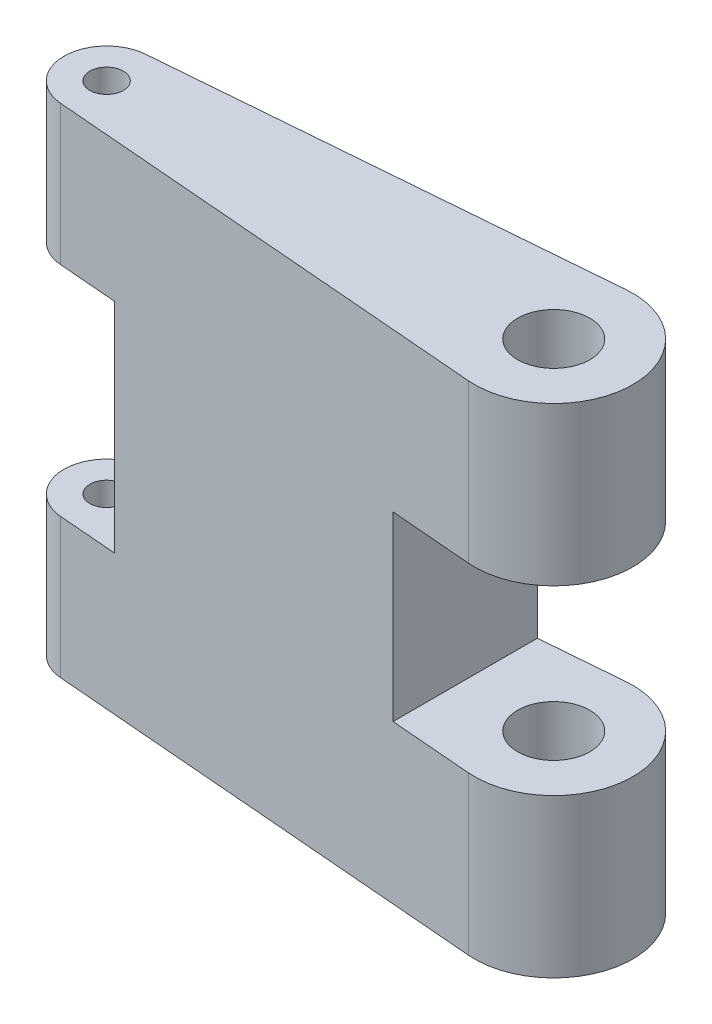
ISO-10303-21;
HEADER;
FILE_DESCRIPTION(('STEP AP214'),'2;1');
FILE_NAME('part.step','',(''),(''),'','','');
FILE_SCHEMA(('AUTOMOTIVE_DESIGN { 1 0 10303 214 1 1 1 1 }'));
ENDSEC;
DATA;
#1=APPLICATION_CONTEXT('core data for automotive mechanical design processes');
#2=APPLICATION_PROTOCOL_DEFINITION('international standard','automotive_design',2000,#1);
#3=PRODUCT_CONTEXT('',#1,'mechanical');
#4=PRODUCT('Part','Part','',(#3));
#5=PRODUCT_RELATED_PRODUCT_CATEGORY('part','',(#4));
#6=PRODUCT_DEFINITION_FORMATION('','',#4);
#7=PRODUCT_DEFINITION_CONTEXT('part definition',#1,'design');
#8=PRODUCT_DEFINITION('design','',#6,#7);
#9=PRODUCT_DEFINITION_SHAPE('','',#8);
#10=(LENGTH_UNIT() NAMED_UNIT(*) SI_UNIT(.MILLI.,.METRE.));
#11=(NAMED_UNIT(*) PLANE_ANGLE_UNIT() SI_UNIT($,.RADIAN.));
#12=(NAMED_UNIT(*) SI_UNIT($,.STERADIAN.) SOLID_ANGLE_UNIT());
#13=UNCERTAINTY_MEASURE_WITH_UNIT(LENGTH_MEASURE(1.E-05),#10,'distance_accuracy_value','');
#14=(GEOMETRIC_REPRESENTATION_CONTEXT(3) GLOBAL_UNCERTAINTY_ASSIGNED_CONTEXT((#13)) GLOBAL_UNIT_ASSIGNED_CONTEXT((#10,
#11,#12)) REPRESENTATION_CONTEXT('',''));
#15=CARTESIAN_POINT('',(0.,0.,0.));
#16=DIRECTION('',(0.,0.,1.));
#17=DIRECTION('',(1.,0.,0.));
#18=AXIS2_PLACEMENT_3D('',#15,#16,#17);
#19=CARTESIAN_POINT('',(-20.32,-11.304095629,0.));
#20=DIRECTION('',(0.,1.,0.));
#21=DIRECTION('',(0.,0.,1.));
#22=AXIS2_PLACEMENT_3D('',#19,#20,#21);
#23=CYLINDRICAL_SURFACE('',#22,1.9378704951052);
#24=DIRECTION('',(0.,1.,0.));
#25=VECTOR('',#24,1.);
#26=CARTESIAN_POINT('',(-20.4781967950132,-11.304095629,-1.93140255510001));
#27=LINE('',#26,#25);
#28=CARTESIAN_POINT('',(-20.4781967950132,4.954095629,-1.93140255510001));
#29=VERTEX_POINT('',#28);
#30=CARTESIAN_POINT('',(-20.4781967950132,11.304095629,-1.93140255510001));
#31=VERTEX_POINT('',#30);
#32=EDGE_CURVE('E208',#29,#31,#27,.T.);
#33=ORIENTED_EDGE('',*,*,#32,.F.);
#34=CARTESIAN_POINT('',(-20.32,4.954095629,0.));
#35=DIRECTION('',(0.,1.,0.));
#36=DIRECTION('',(0.,0.,1.));
#37=AXIS2_PLACEMENT_3D('',#34,#35,#36);
#38=CIRCLE('',#37,1.9378704951052);
#39=CARTESIAN_POINT('',(-20.4781967950132,4.954095629,1.93140255510001));
#40=VERTEX_POINT('',#39);
#41=EDGE_CURVE('E141',#40,#29,#38,.F.);
#42=ORIENTED_EDGE('',*,*,#41,.F.);
#43=DIRECTION('',(0.,1.,0.));
#44=VECTOR('',#43,1.);
#45=CARTESIAN_POINT('',(-20.4781967950132,-11.304095629,1.93140255510001));
#46=LINE('',#45,#44);
#47=CARTESIAN_POINT('',(-20.4781967950132,11.304095629,1.93140255510001));
#48=VERTEX_POINT('',#47);
#49=EDGE_CURVE('E204',#40,#48,#46,.T.);
#50=ORIENTED_EDGE('',*,*,#49,.T.);
#51=CARTESIAN_POINT('',(-20.32,11.304095629,0.));
#52=DIRECTION('',(0.,1.,0.));
#53=DIRECTION('',(0.,0.,1.));
#54=AXIS2_PLACEMENT_3D('',#51,#52,#53);
#55=CIRCLE('',#54,1.9378704951052);
#56=EDGE_CURVE('E192',#31,#48,#55,.T.);
#57=ORIENTED_EDGE('',*,*,#56,.F.);
#58=EDGE_LOOP('',(#33,#42,#50,#57));
#59=FACE_BOUND('',#58,.T.);
#60=ADVANCED_FACE('F32',(#59),#23,.T.);
#61=CARTESIAN_POINT('',(0.,-11.304095629,0.));
#62=DIRECTION('',(0.,1.,0.));
#63=DIRECTION('',(0.,0.,1.));
#64=AXIS2_PLACEMENT_3D('',#61,#62,#63);
#65=CYLINDRICAL_SURFACE('',#64,3.59668045314266);
#66=DIRECTION('',(0.,1.,0.));
#67=VECTOR('',#66,1.);
#68=CARTESIAN_POINT('',(-0.293612664938569,-11.304095629,-3.58467598047664));
#69=LINE('',#68,#67);
#70=CARTESIAN_POINT('',(-0.293612664938569,-11.304095629,-3.58467598047664));
#71=VERTEX_POINT('',#70);
#72=CARTESIAN_POINT('',(-0.293612664938569,-4.1261685727369,-3.58467598047664));
#73=VERTEX_POINT('',#72);
#74=EDGE_CURVE('E209',#71,#73,#69,.T.);
#75=ORIENTED_EDGE('',*,*,#74,.T.);
#76=CARTESIAN_POINT('',(0.,-4.1261685727369,0.));
#77=DIRECTION('',(0.,-1.,0.));
#78=DIRECTION('',(0.,0.,-1.));
#79=AXIS2_PLACEMENT_3D('',#76,#77,#78);
#80=CIRCLE('',#79,3.59668045314266);
#81=CARTESIAN_POINT('',(-0.293612664938569,-4.1261685727369,3.58467598047664));
#82=VERTEX_POINT('',#81);
#83=EDGE_CURVE('E56',#82,#73,#80,.F.);
#84=ORIENTED_EDGE('',*,*,#83,.F.);
#85=DIRECTION('',(0.,1.,0.));
#86=VECTOR('',#85,1.);
#87=CARTESIAN_POINT('',(-0.293612664938569,-11.304095629,3.58467598047664));
#88=LINE('',#87,#86);
#89=CARTESIAN_POINT('',(-0.293612664938569,-11.304095629,3.58467598047664));
#90=VERTEX_POINT('',#89);
#91=EDGE_CURVE('E197',#90,#82,#88,.T.);
#92=ORIENTED_EDGE('',*,*,#91,.F.);
#93=CARTESIAN_POINT('',(0.,-11.304095629,0.));
#94=DIRECTION('',(0.,1.,0.));
#95=DIRECTION('',(0.,0.,1.));
#96=AXIS2_PLACEMENT_3D('',#93,#94,#95);
#97=CIRCLE('',#96,3.59668045314266);
#98=EDGE_CURVE('E173',#90,#71,#97,.T.);
#99=ORIENTED_EDGE('',*,*,#98,.T.);
#100=EDGE_LOOP('',(#75,#84,#92,#99));
#101=FACE_BOUND('',#100,.T.);
#102=ADVANCED_FACE('F236',(#101),#65,.T.);
#103=CARTESIAN_POINT('',(0.,4.1261685727369,0.));
#104=DIRECTION('',(0.,1.,0.));
#105=DIRECTION('',(0.,0.,1.));
#106=AXIS2_PLACEMENT_3D('',#103,#104,#105);
#107=CIRCLE('',#106,3.59668045314266);
#108=CARTESIAN_POINT('',(-0.293612664938569,4.1261685727369,-3.58467598047664));
#109=VERTEX_POINT('',#108);
#110=CARTESIAN_POINT('',(-0.293612664938569,4.1261685727369,3.58467598047664));
#111=VERTEX_POINT('',#110);
#112=EDGE_CURVE('E166',#109,#111,#107,.F.);
#113=ORIENTED_EDGE('',*,*,#112,.F.);
#114=CARTESIAN_POINT('',(-0.293612664938569,11.304095629,-3.58467598047664));
#115=VERTEX_POINT('',#114);
#116=EDGE_CURVE('E186',#109,#115,#69,.T.);
#117=ORIENTED_EDGE('',*,*,#116,.T.);
#118=CARTESIAN_POINT('',(0.,11.304095629,0.));
#119=DIRECTION('',(0.,1.,0.));
#120=DIRECTION('',(0.,0.,1.));
#121=AXIS2_PLACEMENT_3D('',#118,#119,#120);
#122=CIRCLE('',#121,3.59668045314266);
#123=CARTESIAN_POINT('',(-0.293612664938569,11.304095629,3.58467598047664));
#124=VERTEX_POINT('',#123);
#125=EDGE_CURVE('E172',#124,#115,#122,.T.);
#126=ORIENTED_EDGE('',*,*,#125,.F.);
#127=EDGE_CURVE('E201',#111,#124,#88,.T.);
#128=ORIENTED_EDGE('',*,*,#127,.F.);
#129=EDGE_LOOP('',(#113,#117,#126,#128));
#130=FACE_BOUND('',#129,.T.);
#131=ADVANCED_FACE('F34',(#130),#65,.T.);
#132=CARTESIAN_POINT('',(-20.4781967950132,-11.304095629,1.93140255510001));
#133=DIRECTION('',(-0.081634348328615,0.,0.996662346621443));
#134=DIRECTION('',(0.996662346621444,0.,0.081634348328615));
#135=AXIS2_PLACEMENT_3D('',#132,#133,#134);
#136=PLANE('',#135);
#137=DIRECTION('',(-0.996662346621444,0.,-0.081634348328615));
#138=VECTOR('',#137,1.);
#139=CARTESIAN_POINT('',(-20.4781967950132,4.954095629,1.93140255510001));
#140=LINE('',#139,#138);
#141=CARTESIAN_POINT('',(-17.8128704951052,4.954095629,2.14971337652683));
#142=VERTEX_POINT('',#141);
#143=EDGE_CURVE('E140',#142,#40,#140,.T.);
#144=ORIENTED_EDGE('',*,*,#143,.F.);
#145=DIRECTION('',(0.,1.,0.));
#146=VECTOR('',#145,1.);
#147=CARTESIAN_POINT('',(-17.8128704951052,-11.304095629,2.14971337652683));
#148=LINE('',#147,#146);
#149=CARTESIAN_POINT('',(-17.8128704951052,-4.954095629,2.14971337652683));
#150=VERTEX_POINT('',#149);
#151=EDGE_CURVE('E126',#150,#142,#148,.T.);
#152=ORIENTED_EDGE('',*,*,#151,.F.);
#153=DIRECTION('',(0.996662346621444,0.,0.081634348328615));
#154=VECTOR('',#153,1.);
#155=CARTESIAN_POINT('',(-20.4781967950132,-4.954095629,1.93140255510001));
#156=LINE('',#155,#154);
#157=CARTESIAN_POINT('',(-20.4781967950132,-4.954095629,1.93140255510001));
#158=VERTEX_POINT('',#157);
#159=EDGE_CURVE('E120',#158,#150,#156,.T.);
#160=ORIENTED_EDGE('',*,*,#159,.F.);
#161=CARTESIAN_POINT('',(-20.4781967950132,-11.304095629,1.93140255510001));
#162=VERTEX_POINT('',#161);
#163=EDGE_CURVE('E202',#162,#158,#46,.T.);
#164=ORIENTED_EDGE('',*,*,#163,.F.);
#165=DIRECTION('',(0.996662346621443,0.,0.081634348328615));
#166=VECTOR('',#165,1.);
#167=CARTESIAN_POINT('',(-20.4781967950132,-11.304095629,1.93140255510001));
#168=LINE('',#167,#166);
#169=EDGE_CURVE('E183',#162,#90,#168,.T.);
#170=ORIENTED_EDGE('',*,*,#169,.T.);
#171=ORIENTED_EDGE('',*,*,#91,.T.);
#172=DIRECTION('',(0.996662346621444,0.,0.081634348328615));
#173=VECTOR('',#172,1.);
#174=CARTESIAN_POINT('',(-20.4781967950132,-4.1261685727369,1.93140255510001));
#175=LINE('',#174,#173);
#176=CARTESIAN_POINT('',(-4.02331954685733,-4.1261685727369,3.2791841639208));
#177=VERTEX_POINT('',#176);
#178=EDGE_CURVE('E164',#177,#82,#175,.T.);
#179=ORIENTED_EDGE('',*,*,#178,.F.);
#180=DIRECTION('',(0.,-1.,0.));
#181=VECTOR('',#180,1.);
#182=CARTESIAN_POINT('',(-4.02331954685733,-11.304095629,3.2791841639208));
#183=LINE('',#182,#181);
#184=CARTESIAN_POINT('',(-4.02331954685733,4.1261685727369,3.2791841639208));
#185=VERTEX_POINT('',#184);
#186=EDGE_CURVE('E170',#185,#177,#183,.T.);
#187=ORIENTED_EDGE('',*,*,#186,.F.);
#188=DIRECTION('',(-0.996662346621444,0.,-0.081634348328615));
#189=VECTOR('',#188,1.);
#190=CARTESIAN_POINT('',(-20.4781967950132,4.1261685727369,1.93140255510001));
#191=LINE('',#190,#189);
#192=EDGE_CURVE('E168',#111,#185,#191,.T.);
#193=ORIENTED_EDGE('',*,*,#192,.F.);
#194=ORIENTED_EDGE('',*,*,#127,.T.);
#195=DIRECTION('',(0.996662346621443,0.,0.081634348328615));
#196=VECTOR('',#195,1.);
#197=CARTESIAN_POINT('',(-20.4781967950132,11.304095629,1.93140255510001));
#198=LINE('',#197,#196);
#199=EDGE_CURVE('E177',#48,#124,#198,.T.);
#200=ORIENTED_EDGE('',*,*,#199,.F.);
#201=ORIENTED_EDGE('',*,*,#49,.F.);
#202=EDGE_LOOP('',(#144,#152,#160,#164,#170,#171,#179,#187,#193,#194,#200,#201));
#203=FACE_BOUND('',#202,.T.);
#204=ADVANCED_FACE('F138',(#203),#136,.T.);
#205=CARTESIAN_POINT('',(-20.32,-4.954095629,0.));
#206=DIRECTION('',(0.,-1.,0.));
#207=DIRECTION('',(0.,0.,-1.));
#208=AXIS2_PLACEMENT_3D('',#205,#206,#207);
#209=CIRCLE('',#208,1.9378704951052);
#210=CARTESIAN_POINT('',(-20.4781967950132,-4.954095629,-1.93140255510001));
#211=VERTEX_POINT('',#210);
#212=EDGE_CURVE('E122',#211,#158,#209,.F.);
#213=ORIENTED_EDGE('',*,*,#212,.F.);
#214=CARTESIAN_POINT('',(-20.4781967950132,-11.304095629,-1.93140255510001));
#215=VERTEX_POINT('',#214);
#216=EDGE_CURVE('E205',#215,#211,#27,.T.);
#217=ORIENTED_EDGE('',*,*,#216,.F.);
#218=CARTESIAN_POINT('',(-20.32,-11.304095629,0.));
#219=DIRECTION('',(0.,1.,0.));
#220=DIRECTION('',(0.,0.,1.));
#221=AXIS2_PLACEMENT_3D('',#218,#219,#220);
#222=CIRCLE('',#221,1.9378704951052);
#223=EDGE_CURVE('E180',#215,#162,#222,.T.);
#224=ORIENTED_EDGE('',*,*,#223,.T.);
#225=ORIENTED_EDGE('',*,*,#163,.T.);
#226=EDGE_LOOP('',(#213,#217,#224,#225));
#227=FACE_BOUND('',#226,.T.);
#228=ADVANCED_FACE('F228',(#227),#23,.T.);
#229=CARTESIAN_POINT('',(-0.293612664938569,-11.304095629,-3.58467598047664));
#230=DIRECTION('',(-0.0816343483286153,0.,-0.996662346621443));
#231=DIRECTION('',(-0.996662346621444,0.,0.0816343483286153));
#232=AXIS2_PLACEMENT_3D('',#229,#230,#231);
#233=PLANE('',#232);
#234=DIRECTION('',(0.996662346621444,0.,-0.0816343483286153));
#235=VECTOR('',#234,1.);
#236=CARTESIAN_POINT('',(-0.293612664938569,4.954095629,-3.58467598047664));
#237=LINE('',#236,#235);
#238=CARTESIAN_POINT('',(-17.8128704951052,4.954095629,-2.14971337652682));
#239=VERTEX_POINT('',#238);
#240=EDGE_CURVE('E11',#29,#239,#237,.T.);
#241=ORIENTED_EDGE('',*,*,#240,.F.);
#242=ORIENTED_EDGE('',*,*,#32,.T.);
#243=DIRECTION('',(-0.996662346621443,0.,0.0816343483286153));
#244=VECTOR('',#243,1.);
#245=CARTESIAN_POINT('',(-0.293612664938569,11.304095629,-3.58467598047664));
#246=LINE('',#245,#244);
#247=EDGE_CURVE('E189',#115,#31,#246,.T.);
#248=ORIENTED_EDGE('',*,*,#247,.F.);
#249=ORIENTED_EDGE('',*,*,#116,.F.);
#250=DIRECTION('',(0.996662346621444,0.,-0.0816343483286153));
#251=VECTOR('',#250,1.);
#252=CARTESIAN_POINT('',(-0.293612664938569,4.1261685727369,-3.58467598047664));
#253=LINE('',#252,#251);
#254=CARTESIAN_POINT('',(-4.02331954685734,4.1261685727369,-3.2791841639208));
#255=VERTEX_POINT('',#254);
#256=EDGE_CURVE('E215',#255,#109,#253,.T.);
#257=ORIENTED_EDGE('',*,*,#256,.F.);
#258=DIRECTION('',(0.,1.,0.));
#259=VECTOR('',#258,1.);
#260=CARTESIAN_POINT('',(-4.02331954685734,-11.304095629,-3.2791841639208));
#261=LINE('',#260,#259);
#262=CARTESIAN_POINT('',(-4.02331954685734,-4.1261685727369,-3.2791841639208));
#263=VERTEX_POINT('',#262);
#264=EDGE_CURVE('E213',#263,#255,#261,.T.);
#265=ORIENTED_EDGE('',*,*,#264,.F.);
#266=DIRECTION('',(-0.996662346621444,0.,0.0816343483286153));
#267=VECTOR('',#266,1.);
#268=CARTESIAN_POINT('',(-0.293612664938569,-4.1261685727369,-3.58467598047664));
#269=LINE('',#268,#267);
#270=EDGE_CURVE('E200',#73,#263,#269,.T.);
#271=ORIENTED_EDGE('',*,*,#270,.F.);
#272=ORIENTED_EDGE('',*,*,#74,.F.);
#273=DIRECTION('',(-0.996662346621443,0.,0.0816343483286153));
#274=VECTOR('',#273,1.);
#275=CARTESIAN_POINT('',(-0.293612664938569,-11.304095629,-3.58467598047664));
#276=LINE('',#275,#274);
#277=EDGE_CURVE('E176',#71,#215,#276,.T.);
#278=ORIENTED_EDGE('',*,*,#277,.T.);
#279=ORIENTED_EDGE('',*,*,#216,.T.);
#280=DIRECTION('',(-0.996662346621444,0.,0.0816343483286153));
#281=VECTOR('',#280,1.);
#282=CARTESIAN_POINT('',(-0.293612664938569,-4.954095629,-3.58467598047664));
#283=LINE('',#282,#281);
#284=CARTESIAN_POINT('',(-17.8128704951052,-4.954095629,-2.14971337652682));
#285=VERTEX_POINT('',#284);
#286=EDGE_CURVE('E218',#285,#211,#283,.T.);
#287=ORIENTED_EDGE('',*,*,#286,.F.);
#288=DIRECTION('',(0.,-1.,0.));
#289=VECTOR('',#288,1.);
#290=CARTESIAN_POINT('',(-17.8128704951052,-11.304095629,-2.14971337652682));
#291=LINE('',#290,#289);
#292=EDGE_CURVE('E41',#239,#285,#291,.T.);
#293=ORIENTED_EDGE('',*,*,#292,.F.);
#294=EDGE_LOOP('',(#241,#242,#248,#249,#257,#265,#271,#272,#278,#279,#287,#293));
#295=FACE_BOUND('',#294,.T.);
#296=ADVANCED_FACE('F224',(#295),#233,.T.);
#297=CARTESIAN_POINT('',(0.,-11.304095629,0.));
#298=DIRECTION('',(0.,1.,0.));
#299=DIRECTION('',(0.,0.,1.));
#300=AXIS2_PLACEMENT_3D('',#297,#298,#299);
#301=PLANE('',#300);
#302=CARTESIAN_POINT('',(-20.32,-11.304095629,0.));
#303=DIRECTION('',(0.,-1.,0.));
#304=DIRECTION('',(0.,0.,-1.));
#305=AXIS2_PLACEMENT_3D('',#302,#303,#304);
#306=CIRCLE('',#305,0.761999999999999);
#307=CARTESIAN_POINT('',(-20.32,-11.304095629,-0.761999999999997));
#308=VERTEX_POINT('',#307);
#309=EDGE_CURVE('E298',#308,#308,#306,.T.);
#310=ORIENTED_EDGE('',*,*,#309,.F.);
#311=EDGE_LOOP('',(#310));
#312=FACE_BOUND('',#311,.T.);
#313=CARTESIAN_POINT('',(0.,-11.304095629,0.));
#314=DIRECTION('',(0.,-1.,0.));
#315=DIRECTION('',(0.,0.,-1.));
#316=AXIS2_PLACEMENT_3D('',#313,#314,#315);
#317=CIRCLE('',#316,1.64);
#318=CARTESIAN_POINT('',(0.,-11.304095629,-1.64));
#319=VERTEX_POINT('',#318);
#320=EDGE_CURVE('E147',#319,#319,#317,.T.);
#321=ORIENTED_EDGE('',*,*,#320,.F.);
#322=EDGE_LOOP('',(#321));
#323=FACE_BOUND('',#322,.T.);
#324=ORIENTED_EDGE('',*,*,#98,.F.);
#325=ORIENTED_EDGE('',*,*,#169,.F.);
#326=ORIENTED_EDGE('',*,*,#223,.F.);
#327=ORIENTED_EDGE('',*,*,#277,.F.);
#328=EDGE_LOOP('',(#324,#325,#326,#327));
#329=FACE_BOUND('',#328,.T.);
#330=ADVANCED_FACE('F232',(#312,#323,#329),#301,.F.);
#331=CARTESIAN_POINT('',(0.,11.304095629,0.));
#332=DIRECTION('',(0.,1.,0.));
#333=DIRECTION('',(0.,0.,1.));
#334=AXIS2_PLACEMENT_3D('',#331,#332,#333);
#335=PLANE('',#334);
#336=CARTESIAN_POINT('',(-20.32,11.304095629,0.));
#337=DIRECTION('',(0.,-1.,0.));
#338=DIRECTION('',(0.,0.,-1.));
#339=AXIS2_PLACEMENT_3D('',#336,#337,#338);
#340=CIRCLE('',#339,0.761999999999999);
#341=CARTESIAN_POINT('',(-20.32,11.304095629,-0.761999999999997));
#342=VERTEX_POINT('',#341);
#343=EDGE_CURVE('E329',#342,#342,#340,.T.);
#344=ORIENTED_EDGE('',*,*,#343,.T.);
#345=EDGE_LOOP('',(#344));
#346=FACE_BOUND('',#345,.T.);
#347=CARTESIAN_POINT('',(0.,11.304095629,0.));
#348=DIRECTION('',(0.,-1.,0.));
#349=DIRECTION('',(0.,0.,-1.));
#350=AXIS2_PLACEMENT_3D('',#347,#348,#349);
#351=CIRCLE('',#350,1.64);
#352=CARTESIAN_POINT('',(0.,11.304095629,-1.64));
#353=VERTEX_POINT('',#352);
#354=EDGE_CURVE('E148',#353,#353,#351,.T.);
#355=ORIENTED_EDGE('',*,*,#354,.T.);
#356=EDGE_LOOP('',(#355));
#357=FACE_BOUND('',#356,.T.);
#358=ORIENTED_EDGE('',*,*,#125,.T.);
#359=ORIENTED_EDGE('',*,*,#247,.T.);
#360=ORIENTED_EDGE('',*,*,#56,.T.);
#361=ORIENTED_EDGE('',*,*,#199,.T.);
#362=EDGE_LOOP('',(#358,#359,#360,#361));
#363=FACE_BOUND('',#362,.T.);
#364=ADVANCED_FACE('F253',(#346,#357,#363),#335,.T.);
#365=CARTESIAN_POINT('',(-4.02331954685734,-4.1261685727369,-3.59668045314266));
#366=DIRECTION('',(-1.,0.,0.));
#367=DIRECTION('',(0.,0.,1.));
#368=AXIS2_PLACEMENT_3D('',#365,#366,#367);
#369=PLANE('',#368);
#370=ORIENTED_EDGE('',*,*,#186,.T.);
#371=DIRECTION('',(0.,0.,1.));
#372=VECTOR('',#371,1.);
#373=CARTESIAN_POINT('',(-4.02331954685734,-4.1261685727369,-3.59668045314266));
#374=LINE('',#373,#372);
#375=EDGE_CURVE('E157',#263,#177,#374,.T.);
#376=ORIENTED_EDGE('',*,*,#375,.F.);
#377=ORIENTED_EDGE('',*,*,#264,.T.);
#378=DIRECTION('',(0.,0.,1.));
#379=VECTOR('',#378,1.);
#380=CARTESIAN_POINT('',(-4.02331954685734,4.1261685727369,-3.59668045314266));
#381=LINE('',#380,#379);
#382=EDGE_CURVE('E158',#255,#185,#381,.T.);
#383=ORIENTED_EDGE('',*,*,#382,.T.);
#384=EDGE_LOOP('',(#370,#376,#377,#383));
#385=FACE_BOUND('',#384,.T.);
#386=ADVANCED_FACE('F242',(#385),#369,.F.);
#387=CARTESIAN_POINT('',(-4.02331954685734,4.1261685727369,-3.59668045314266));
#388=DIRECTION('',(0.,1.,0.));
#389=DIRECTION('',(0.,0.,1.));
#390=AXIS2_PLACEMENT_3D('',#387,#388,#389);
#391=PLANE('',#390);
#392=CARTESIAN_POINT('',(0.,4.1261685727369,0.));
#393=DIRECTION('',(0.,1.,0.));
#394=DIRECTION('',(0.,0.,1.));
#395=AXIS2_PLACEMENT_3D('',#392,#393,#394);
#396=CIRCLE('',#395,1.64);
#397=CARTESIAN_POINT('',(0.,4.1261685727369,-1.64));
#398=VERTEX_POINT('',#397);
#399=EDGE_CURVE('E154',#398,#398,#396,.T.);
#400=ORIENTED_EDGE('',*,*,#399,.T.);
#401=EDGE_LOOP('',(#400));
#402=FACE_BOUND('',#401,.T.);
#403=ORIENTED_EDGE('',*,*,#192,.T.);
#404=ORIENTED_EDGE('',*,*,#382,.F.);
#405=ORIENTED_EDGE('',*,*,#256,.T.);
#406=ORIENTED_EDGE('',*,*,#112,.T.);
#407=EDGE_LOOP('',(#403,#404,#405,#406));
#408=FACE_BOUND('',#407,.T.);
#409=ADVANCED_FACE('F260',(#402,#408),#391,.F.);
#410=CARTESIAN_POINT('',(-4.02331954685734,-4.1261685727369,-3.59668045314266));
#411=DIRECTION('',(0.,-1.,0.));
#412=DIRECTION('',(0.,0.,-1.));
#413=AXIS2_PLACEMENT_3D('',#410,#411,#412);
#414=PLANE('',#413);
#415=CARTESIAN_POINT('',(0.,-4.1261685727369,0.));
#416=DIRECTION('',(0.,-1.,0.));
#417=DIRECTION('',(0.,0.,-1.));
#418=AXIS2_PLACEMENT_3D('',#415,#416,#417);
#419=CIRCLE('',#418,1.64);
#420=CARTESIAN_POINT('',(0.,-4.12616857273689,-1.64));
#421=VERTEX_POINT('',#420);
#422=EDGE_CURVE('E151',#421,#421,#419,.T.);
#423=ORIENTED_EDGE('',*,*,#422,.T.);
#424=EDGE_LOOP('',(#423));
#425=FACE_BOUND('',#424,.T.);
#426=ORIENTED_EDGE('',*,*,#178,.T.);
#427=ORIENTED_EDGE('',*,*,#83,.T.);
#428=ORIENTED_EDGE('',*,*,#270,.T.);
#429=ORIENTED_EDGE('',*,*,#375,.T.);
#430=EDGE_LOOP('',(#426,#427,#428,#429));
#431=FACE_BOUND('',#430,.T.);
#432=ADVANCED_FACE('F240',(#425,#431),#414,.F.);
#433=CARTESIAN_POINT('',(0.,11.304095629,0.));
#434=DIRECTION('',(0.,-1.,0.));
#435=DIRECTION('',(0.,0.,-1.));
#436=AXIS2_PLACEMENT_3D('',#433,#434,#435);
#437=CYLINDRICAL_SURFACE('',#436,1.64);
#438=CARTESIAN_POINT('',(0.,-11.304095629,-1.64));
#439=CARTESIAN_POINT('',(0.,-11.2293255554973,-1.64));
#440=CARTESIAN_POINT('',(0.,-11.1545554819945,-1.64));
#441=CARTESIAN_POINT('',(0.,-11.005015334989,-1.64));
#442=CARTESIAN_POINT('',(0.,-10.9302452614863,-1.64));
#443=CARTESIAN_POINT('',(0.,-10.7807051144808,-1.64));
#444=CARTESIAN_POINT('',(0.,-10.7059350409781,-1.64));
#445=CARTESIAN_POINT('',(0.,-10.5563948939726,-1.64));
#446=CARTESIAN_POINT('',(0.,-10.4816248204699,-1.64));
#447=CARTESIAN_POINT('',(0.,-10.3320846734644,-1.64));
#448=CARTESIAN_POINT('',(0.,-10.2573145999616,-1.64));
#449=CARTESIAN_POINT('',(0.,-10.1077744529561,-1.64));
#450=CARTESIAN_POINT('',(0.,-10.0330043794534,-1.64));
#451=CARTESIAN_POINT('',(0.,-9.88346423244793,-1.64));
#452=CARTESIAN_POINT('',(0.,-9.80869415894519,-1.64));
#453=CARTESIAN_POINT('',(0.,-9.65915401193971,-1.64));
#454=CARTESIAN_POINT('',(0.,-9.58438393843697,-1.64));
#455=CARTESIAN_POINT('',(0.,-9.43484379143148,-1.64));
#456=CARTESIAN_POINT('',(0.,-9.36007371792874,-1.64));
#457=CARTESIAN_POINT('',(0.,-9.21053357092326,-1.64));
#458=CARTESIAN_POINT('',(0.,-9.13576349742052,-1.64));
#459=CARTESIAN_POINT('',(0.,-8.98622335041504,-1.64));
#460=CARTESIAN_POINT('',(0.,-8.9114532769123,-1.64));
#461=CARTESIAN_POINT('',(0.,-8.76191312990682,-1.64));
#462=CARTESIAN_POINT('',(0.,-8.68714305640408,-1.64));
#463=CARTESIAN_POINT('',(0.,-8.5376029093986,-1.64));
#464=CARTESIAN_POINT('',(0.,-8.46283283589585,-1.64));
#465=CARTESIAN_POINT('',(0.,-8.31329268889037,-1.64));
#466=CARTESIAN_POINT('',(0.,-8.23852261538763,-1.64));
#467=CARTESIAN_POINT('',(0.,-8.08898246838215,-1.64));
#468=CARTESIAN_POINT('',(0.,-8.01421239487941,-1.64));
#469=CARTESIAN_POINT('',(0.,-7.86467224787393,-1.64));
#470=CARTESIAN_POINT('',(0.,-7.78990217437119,-1.64));
#471=CARTESIAN_POINT('',(0.,-7.64036202736571,-1.64));
#472=CARTESIAN_POINT('',(0.,-7.56559195386297,-1.64));
#473=CARTESIAN_POINT('',(0.,-7.41605180685748,-1.64));
#474=CARTESIAN_POINT('',(0.,-7.34128173335474,-1.64));
#475=CARTESIAN_POINT('',(0.,-7.19174158634926,-1.64));
#476=CARTESIAN_POINT('',(0.,-7.11697151284652,-1.64));
#477=CARTESIAN_POINT('',(0.,-6.96743136584104,-1.64));
#478=CARTESIAN_POINT('',(0.,-6.8926612923383,-1.64));
#479=CARTESIAN_POINT('',(0.,-6.74312114533282,-1.64));
#480=CARTESIAN_POINT('',(0.,-6.66835107183008,-1.64));
#481=CARTESIAN_POINT('',(0.,-6.51881092482459,-1.64));
#482=CARTESIAN_POINT('',(0.,-6.44404085132186,-1.64));
#483=CARTESIAN_POINT('',(0.,-6.29450070431637,-1.64));
#484=CARTESIAN_POINT('',(0.,-6.21973063081363,-1.64));
#485=CARTESIAN_POINT('',(0.,-6.07019048380815,-1.64));
#486=CARTESIAN_POINT('',(0.,-5.99542041030541,-1.64));
#487=CARTESIAN_POINT('',(0.,-5.84588026329993,-1.64));
#488=CARTESIAN_POINT('',(0.,-5.77111018979719,-1.64));
#489=CARTESIAN_POINT('',(0.,-5.62157004279171,-1.64));
#490=CARTESIAN_POINT('',(0.,-5.54679996928897,-1.64));
#491=CARTESIAN_POINT('',(0.,-5.39725982228348,-1.64));
#492=CARTESIAN_POINT('',(0.,-5.32248974878074,-1.64));
#493=CARTESIAN_POINT('',(0.,-5.17294960177526,-1.64));
#494=CARTESIAN_POINT('',(0.,-5.09817952827252,-1.64));
#495=CARTESIAN_POINT('',(0.,-4.94863938126704,-1.64));
#496=CARTESIAN_POINT('',(0.,-4.8738693077643,-1.64));
#497=CARTESIAN_POINT('',(0.,-4.72432916075882,-1.64));
#498=CARTESIAN_POINT('',(0.,-4.64955908725608,-1.64));
#499=CARTESIAN_POINT('',(0.,-4.5000189402506,-1.64));
#500=CARTESIAN_POINT('',(0.,-4.42524886674785,-1.64));
#501=CARTESIAN_POINT('',(0.,-4.27570871974237,-1.64));
#502=CARTESIAN_POINT('',(0.,-4.20093864623963,-1.64));
#503=CARTESIAN_POINT('',(0.,-4.12616857273689,-1.64));
#504=B_SPLINE_CURVE_WITH_KNOTS('',3,(#438,#439,#440,#441,#442,#443,#444,#445,#446,#447,#448,
#449,#450,#451,#452,#453,#454,#455,#456,#457,#458,#459,#460,#461,#462,#463,#464,#465,#466,#467,
#468,#469,#470,#471,#472,#473,#474,#475,#476,#477,#478,#479,#480,#481,#482,#483,#484,#485,#486,
#487,#488,#489,#490,#491,#492,#493,#494,#495,#496,#497,#498,#499,#500,#501,#502,#503),
.UNSPECIFIED.,.F.,.F.,(4,2,2,2,2,2,2,2,2,2,2,2,2,2,2,2,2,2,2,2,2,2,2,2,2,2,2,2,2,2,2,2,4),(0.,
0.224310220508221,0.448620441016446,0.672930661524667,0.897240882032888,1.12155110254111,
1.34586132304933,1.57017154355756,1.79448176406578,2.018791984574,2.24310220508222,
2.46741242559044,2.69172264609866,2.91603286660689,3.14034308711511,3.36465330762333,
3.58896352813155,3.81327374863978,4.037583969148,4.26189418965622,4.48620441016444,
4.71051463067267,4.93482485118089,5.15913507168911,5.38344529219733,5.60775551270555,
5.83206573321378,6.056375953722,6.28068617423022,6.50499639473844,6.72930661524666,
6.95361683575489,7.17792705626311),.UNSPECIFIED.);
#505=EDGE_CURVE('BSEAM268',#319,#421,#504,.T.);
#506=ORIENTED_EDGE('',*,*,#320,.T.);
#507=ORIENTED_EDGE('',*,*,#422,.F.);
#508=ORIENTED_EDGE('',*,*,#505,.T.);
#509=ORIENTED_EDGE('',*,*,#505,.F.);
#510=EDGE_LOOP('',(#506,#508,#507,#509));
#511=FACE_BOUND('',#510,.T.);
#512=ADVANCED_FACE('F268',(#511),#437,.F.);
#513=CARTESIAN_POINT('',(0.,11.304095629,-1.64));
#514=CARTESIAN_POINT('',(0.,11.2293255554973,-1.64));
#515=CARTESIAN_POINT('',(0.,11.1545554819945,-1.64));
#516=CARTESIAN_POINT('',(0.,11.005015334989,-1.64));
#517=CARTESIAN_POINT('',(0.,10.9302452614863,-1.64));
#518=CARTESIAN_POINT('',(0.,10.7807051144808,-1.64));
#519=CARTESIAN_POINT('',(0.,10.7059350409781,-1.64));
#520=CARTESIAN_POINT('',(0.,10.5563948939726,-1.64));
#521=CARTESIAN_POINT('',(0.,10.4816248204699,-1.64));
#522=CARTESIAN_POINT('',(0.,10.3320846734644,-1.64));
#523=CARTESIAN_POINT('',(0.,10.2573145999616,-1.64));
#524=CARTESIAN_POINT('',(0.,10.1077744529561,-1.64));
#525=CARTESIAN_POINT('',(0.,10.0330043794534,-1.64));
#526=CARTESIAN_POINT('',(0.,9.88346423244793,-1.64));
#527=CARTESIAN_POINT('',(0.,9.80869415894519,-1.64));
#528=CARTESIAN_POINT('',(0.,9.65915401193971,-1.64));
#529=CARTESIAN_POINT('',(0.,9.58438393843696,-1.64));
#530=CARTESIAN_POINT('',(0.,9.43484379143148,-1.64));
#531=CARTESIAN_POINT('',(0.,9.36007371792874,-1.64));
#532=CARTESIAN_POINT('',(0.,9.21053357092326,-1.64));
#533=CARTESIAN_POINT('',(0.,9.13576349742052,-1.64));
#534=CARTESIAN_POINT('',(0.,8.98622335041504,-1.64));
#535=CARTESIAN_POINT('',(0.,8.9114532769123,-1.64));
#536=CARTESIAN_POINT('',(0.,8.76191312990682,-1.64));
#537=CARTESIAN_POINT('',(0.,8.68714305640408,-1.64));
#538=CARTESIAN_POINT('',(0.,8.5376029093986,-1.64));
#539=CARTESIAN_POINT('',(0.,8.46283283589585,-1.64));
#540=CARTESIAN_POINT('',(0.,8.31329268889037,-1.64));
#541=CARTESIAN_POINT('',(0.,8.23852261538763,-1.64));
#542=CARTESIAN_POINT('',(0.,8.08898246838215,-1.64));
#543=CARTESIAN_POINT('',(0.,8.01421239487941,-1.64));
#544=CARTESIAN_POINT('',(0.,7.86467224787393,-1.64));
#545=CARTESIAN_POINT('',(0.,7.78990217437119,-1.64));
#546=CARTESIAN_POINT('',(0.,7.64036202736571,-1.64));
#547=CARTESIAN_POINT('',(0.,7.56559195386297,-1.64));
#548=CARTESIAN_POINT('',(0.,7.41605180685749,-1.64));
#549=CARTESIAN_POINT('',(0.,7.34128173335474,-1.64));
#550=CARTESIAN_POINT('',(0.,7.19174158634926,-1.64));
#551=CARTESIAN_POINT('',(0.,7.11697151284652,-1.64));
#552=CARTESIAN_POINT('',(0.,6.96743136584104,-1.64));
#553=CARTESIAN_POINT('',(0.,6.8926612923383,-1.64));
#554=CARTESIAN_POINT('',(0.,6.74312114533282,-1.64));
#555=CARTESIAN_POINT('',(0.,6.66835107183008,-1.64));
#556=CARTESIAN_POINT('',(0.,6.5188109248246,-1.64));
#557=CARTESIAN_POINT('',(0.,6.44404085132186,-1.64));
#558=CARTESIAN_POINT('',(0.,6.29450070431638,-1.64));
#559=CARTESIAN_POINT('',(0.,6.21973063081363,-1.64));
#560=CARTESIAN_POINT('',(0.,6.07019048380815,-1.64));
#561=CARTESIAN_POINT('',(0.,5.99542041030541,-1.64));
#562=CARTESIAN_POINT('',(0.,5.84588026329993,-1.64));
#563=CARTESIAN_POINT('',(0.,5.77111018979719,-1.64));
#564=CARTESIAN_POINT('',(0.,5.62157004279171,-1.64));
#565=CARTESIAN_POINT('',(0.,5.54679996928897,-1.64));
#566=CARTESIAN_POINT('',(0.,5.39725982228349,-1.64));
#567=CARTESIAN_POINT('',(0.,5.32248974878075,-1.64));
#568=CARTESIAN_POINT('',(0.,5.17294960177527,-1.64));
#569=CARTESIAN_POINT('',(0.,5.09817952827253,-1.64));
#570=CARTESIAN_POINT('',(0.,4.94863938126704,-1.64));
#571=CARTESIAN_POINT('',(0.,4.8738693077643,-1.64));
#572=CARTESIAN_POINT('',(0.,4.72432916075882,-1.64));
#573=CARTESIAN_POINT('',(0.,4.64955908725608,-1.64));
#574=CARTESIAN_POINT('',(0.,4.5000189402506,-1.64));
#575=CARTESIAN_POINT('',(0.,4.42524886674786,-1.64));
#576=CARTESIAN_POINT('',(0.,4.27570871974238,-1.64));
#577=CARTESIAN_POINT('',(0.,4.20093864623964,-1.64));
#578=CARTESIAN_POINT('',(0.,4.1261685727369,-1.64));
#579=B_SPLINE_CURVE_WITH_KNOTS('',3,(#513,#514,#515,#516,#517,#518,#519,#520,#521,#522,#523,
#524,#525,#526,#527,#528,#529,#530,#531,#532,#533,#534,#535,#536,#537,#538,#539,#540,#541,#542,
#543,#544,#545,#546,#547,#548,#549,#550,#551,#552,#553,#554,#555,#556,#557,#558,#559,#560,#561,
#562,#563,#564,#565,#566,#567,#568,#569,#570,#571,#572,#573,#574,#575,#576,#577,#578),
.UNSPECIFIED.,.F.,.F.,(4,2,2,2,2,2,2,2,2,2,2,2,2,2,2,2,2,2,2,2,2,2,2,2,2,2,2,2,2,2,2,2,4),(0.,
0.224310220508221,0.448620441016442,0.672930661524665,0.897240882032887,1.12155110254111,
1.34586132304933,1.57017154355755,1.79448176406577,2.018791984574,2.24310220508222,
2.46741242559044,2.69172264609866,2.91603286660688,3.14034308711511,3.36465330762333,
3.58896352813155,3.81327374863977,4.03758396914799,4.26189418965622,4.48620441016444,
4.71051463067266,4.93482485118088,5.1591350716891,5.38344529219733,5.60775551270555,
5.83206573321377,6.05637595372199,6.28068617423021,6.50499639473844,6.72930661524666,
6.95361683575488,7.1779270562631),.UNSPECIFIED.);
#580=EDGE_CURVE('BSEAM303',#353,#398,#579,.T.);
#581=ORIENTED_EDGE('',*,*,#354,.F.);
#582=ORIENTED_EDGE('',*,*,#399,.F.);
#583=ORIENTED_EDGE('',*,*,#580,.T.);
#584=ORIENTED_EDGE('',*,*,#580,.F.);
#585=EDGE_LOOP('',(#581,#583,#582,#584));
#586=FACE_BOUND('',#585,.T.);
#587=ADVANCED_FACE('F303',(#586),#437,.F.);
#588=CARTESIAN_POINT('',(-22.2578704951052,4.954095629,-3.59668045314266));
#589=DIRECTION('',(0.,1.,0.));
#590=DIRECTION('',(0.,0.,1.));
#591=AXIS2_PLACEMENT_3D('',#588,#589,#590);
#592=PLANE('',#591);
#593=CARTESIAN_POINT('',(-20.32,4.954095629,0.));
#594=DIRECTION('',(0.,1.,0.));
#595=DIRECTION('',(0.,0.,1.));
#596=AXIS2_PLACEMENT_3D('',#593,#594,#595);
#597=CIRCLE('',#596,0.761999999999999);
#598=CARTESIAN_POINT('',(-20.32,4.954095629,-0.761999999999997));
#599=VERTEX_POINT('',#598);
#600=EDGE_CURVE('E135',#599,#599,#597,.T.);
#601=ORIENTED_EDGE('',*,*,#600,.T.);
#602=EDGE_LOOP('',(#601));
#603=FACE_BOUND('',#602,.T.);
#604=ORIENTED_EDGE('',*,*,#143,.T.);
#605=ORIENTED_EDGE('',*,*,#41,.T.);
#606=ORIENTED_EDGE('',*,*,#240,.T.);
#607=DIRECTION('',(0.,0.,1.));
#608=VECTOR('',#607,1.);
#609=CARTESIAN_POINT('',(-17.8128704951052,4.954095629,-3.59668045314266));
#610=LINE('',#609,#608);
#611=EDGE_CURVE('E134',#239,#142,#610,.T.);
#612=ORIENTED_EDGE('',*,*,#611,.T.);
#613=EDGE_LOOP('',(#604,#605,#606,#612));
#614=FACE_BOUND('',#613,.T.);
#615=ADVANCED_FACE('F259',(#603,#614),#592,.F.);
#616=CARTESIAN_POINT('',(-17.8128704951052,4.954095629,-3.59668045314266));
#617=DIRECTION('',(1.,0.,0.));
#618=DIRECTION('',(0.,0.,-1.));
#619=AXIS2_PLACEMENT_3D('',#616,#617,#618);
#620=PLANE('',#619);
#621=ORIENTED_EDGE('',*,*,#151,.T.);
#622=ORIENTED_EDGE('',*,*,#611,.F.);
#623=ORIENTED_EDGE('',*,*,#292,.T.);
#624=DIRECTION('',(0.,0.,1.));
#625=VECTOR('',#624,1.);
#626=CARTESIAN_POINT('',(-17.8128704951052,-4.954095629,-3.59668045314266));
#627=LINE('',#626,#625);
#628=EDGE_CURVE('E48',#285,#150,#627,.T.);
#629=ORIENTED_EDGE('',*,*,#628,.T.);
#630=EDGE_LOOP('',(#621,#622,#623,#629));
#631=FACE_BOUND('',#630,.T.);
#632=ADVANCED_FACE('F129',(#631),#620,.F.);
#633=CARTESIAN_POINT('',(-22.2578704951052,-4.954095629,-3.59668045314266));
#634=DIRECTION('',(0.,-1.,0.));
#635=DIRECTION('',(0.,0.,-1.));
#636=AXIS2_PLACEMENT_3D('',#633,#634,#635);
#637=PLANE('',#636);
#638=CARTESIAN_POINT('',(-20.32,-4.954095629,0.));
#639=DIRECTION('',(0.,-1.,0.));
#640=DIRECTION('',(0.,0.,-1.));
#641=AXIS2_PLACEMENT_3D('',#638,#639,#640);
#642=CIRCLE('',#641,0.761999999999999);
#643=CARTESIAN_POINT('',(-20.32,-4.954095629,-0.761999999999997));
#644=VERTEX_POINT('',#643);
#645=EDGE_CURVE('E36',#644,#644,#642,.T.);
#646=ORIENTED_EDGE('',*,*,#645,.T.);
#647=EDGE_LOOP('',(#646));
#648=FACE_BOUND('',#647,.T.);
#649=ORIENTED_EDGE('',*,*,#159,.T.);
#650=ORIENTED_EDGE('',*,*,#628,.F.);
#651=ORIENTED_EDGE('',*,*,#286,.T.);
#652=ORIENTED_EDGE('',*,*,#212,.T.);
#653=EDGE_LOOP('',(#649,#650,#651,#652));
#654=FACE_BOUND('',#653,.T.);
#655=ADVANCED_FACE('F121',(#648,#654),#637,.F.);
#656=CARTESIAN_POINT('',(-20.32,11.304095629,0.));
#657=DIRECTION('',(0.,-1.,0.));
#658=DIRECTION('',(0.,0.,-1.));
#659=AXIS2_PLACEMENT_3D('',#656,#657,#658);
#660=CYLINDRICAL_SURFACE('',#659,0.761999999999999);
#661=CARTESIAN_POINT('',(-20.32,-11.304095629,-0.761999999999997));
#662=CARTESIAN_POINT('',(-20.32,-11.2379497956667,-0.761999999999997));
#663=CARTESIAN_POINT('',(-20.32,-11.1718039623333,-0.761999999999997));
#664=CARTESIAN_POINT('',(-20.32,-11.0395122956667,-0.761999999999997));
#665=CARTESIAN_POINT('',(-20.32,-10.9733664623333,-0.761999999999997));
#666=CARTESIAN_POINT('',(-20.32,-10.8410747956667,-0.761999999999997));
#667=CARTESIAN_POINT('',(-20.32,-10.7749289623333,-0.761999999999997));
#668=CARTESIAN_POINT('',(-20.32,-10.6426372956667,-0.761999999999997));
#669=CARTESIAN_POINT('',(-20.32,-10.5764914623333,-0.761999999999997));
#670=CARTESIAN_POINT('',(-20.32,-10.4441997956667,-0.761999999999997));
#671=CARTESIAN_POINT('',(-20.32,-10.3780539623333,-0.761999999999997));
#672=CARTESIAN_POINT('',(-20.32,-10.2457622956667,-0.761999999999997));
#673=CARTESIAN_POINT('',(-20.32,-10.1796164623333,-0.761999999999997));
#674=CARTESIAN_POINT('',(-20.32,-10.0473247956667,-0.761999999999997));
#675=CARTESIAN_POINT('',(-20.32,-9.98117896233333,-0.761999999999997));
#676=CARTESIAN_POINT('',(-20.32,-9.84888729566667,-0.761999999999997));
#677=CARTESIAN_POINT('',(-20.32,-9.78274146233334,-0.761999999999997));
#678=CARTESIAN_POINT('',(-20.32,-9.65044979566667,-0.761999999999997));
#679=CARTESIAN_POINT('',(-20.32,-9.58430396233334,-0.761999999999997));
#680=CARTESIAN_POINT('',(-20.32,-9.45201229566667,-0.761999999999997));
#681=CARTESIAN_POINT('',(-20.32,-9.38586646233333,-0.761999999999997));
#682=CARTESIAN_POINT('',(-20.32,-9.25357479566667,-0.761999999999997));
#683=CARTESIAN_POINT('',(-20.32,-9.18742896233334,-0.761999999999997));
#684=CARTESIAN_POINT('',(-20.32,-9.05513729566667,-0.761999999999997));
#685=CARTESIAN_POINT('',(-20.32,-8.98899146233333,-0.761999999999997));
#686=CARTESIAN_POINT('',(-20.32,-8.85669979566667,-0.761999999999997));
#687=CARTESIAN_POINT('',(-20.32,-8.79055396233333,-0.761999999999997));
#688=CARTESIAN_POINT('',(-20.32,-8.65826229566667,-0.761999999999997));
#689=CARTESIAN_POINT('',(-20.32,-8.59211646233334,-0.761999999999997));
#690=CARTESIAN_POINT('',(-20.32,-8.45982479566667,-0.761999999999997));
#691=CARTESIAN_POINT('',(-20.32,-8.39367896233333,-0.761999999999997));
#692=CARTESIAN_POINT('',(-20.32,-8.26138729566667,-0.761999999999997));
#693=CARTESIAN_POINT('',(-20.32,-8.19524146233333,-0.761999999999997));
#694=CARTESIAN_POINT('',(-20.32,-8.06294979566667,-0.761999999999997));
#695=CARTESIAN_POINT('',(-20.32,-7.99680396233333,-0.761999999999997));
#696=CARTESIAN_POINT('',(-20.32,-7.86451229566667,-0.761999999999997));
#697=CARTESIAN_POINT('',(-20.32,-7.79836646233333,-0.761999999999997));
#698=CARTESIAN_POINT('',(-20.32,-7.66607479566667,-0.761999999999997));
#699=CARTESIAN_POINT('',(-20.32,-7.59992896233333,-0.761999999999997));
#700=CARTESIAN_POINT('',(-20.32,-7.46763729566667,-0.761999999999997));
#701=CARTESIAN_POINT('',(-20.32,-7.40149146233333,-0.761999999999997));
#702=CARTESIAN_POINT('',(-20.32,-7.26919979566667,-0.761999999999997));
#703=CARTESIAN_POINT('',(-20.32,-7.20305396233333,-0.761999999999997));
#704=CARTESIAN_POINT('',(-20.32,-7.07076229566667,-0.761999999999997));
#705=CARTESIAN_POINT('',(-20.32,-7.00461646233333,-0.761999999999997));
#706=CARTESIAN_POINT('',(-20.32,-6.87232479566667,-0.761999999999997));
#707=CARTESIAN_POINT('',(-20.32,-6.80617896233333,-0.761999999999997));
#708=CARTESIAN_POINT('',(-20.32,-6.67388729566667,-0.761999999999997));
#709=CARTESIAN_POINT('',(-20.32,-6.60774146233333,-0.761999999999997));
#710=CARTESIAN_POINT('',(-20.32,-6.47544979566667,-0.761999999999997));
#711=CARTESIAN_POINT('',(-20.32,-6.40930396233333,-0.761999999999997));
#712=CARTESIAN_POINT('',(-20.32,-6.27701229566667,-0.761999999999997));
#713=CARTESIAN_POINT('',(-20.32,-6.21086646233333,-0.761999999999997));
#714=CARTESIAN_POINT('',(-20.32,-6.07857479566667,-0.761999999999997));
#715=CARTESIAN_POINT('',(-20.32,-6.01242896233333,-0.761999999999997));
#716=CARTESIAN_POINT('',(-20.32,-5.88013729566667,-0.761999999999997));
#717=CARTESIAN_POINT('',(-20.32,-5.81399146233333,-0.761999999999997));
#718=CARTESIAN_POINT('',(-20.32,-5.68169979566667,-0.761999999999997));
#719=CARTESIAN_POINT('',(-20.32,-5.61555396233333,-0.761999999999997));
#720=CARTESIAN_POINT('',(-20.32,-5.48326229566667,-0.761999999999997));
#721=CARTESIAN_POINT('',(-20.32,-5.41711646233333,-0.761999999999997));
#722=CARTESIAN_POINT('',(-20.32,-5.28482479566667,-0.761999999999997));
#723=CARTESIAN_POINT('',(-20.32,-5.21867896233333,-0.761999999999997));
#724=CARTESIAN_POINT('',(-20.32,-5.08638729566667,-0.761999999999997));
#725=CARTESIAN_POINT('',(-20.32,-5.02024146233333,-0.761999999999997));
#726=CARTESIAN_POINT('',(-20.32,-4.954095629,-0.761999999999997));
#727=B_SPLINE_CURVE_WITH_KNOTS('',3,(#661,#662,#663,#664,#665,#666,#667,#668,#669,#670,#671,
#672,#673,#674,#675,#676,#677,#678,#679,#680,#681,#682,#683,#684,#685,#686,#687,#688,#689,#690,
#691,#692,#693,#694,#695,#696,#697,#698,#699,#700,#701,#702,#703,#704,#705,#706,#707,#708,#709,
#710,#711,#712,#713,#714,#715,#716,#717,#718,#719,#720,#721,#722,#723,#724,#725,#726),
.UNSPECIFIED.,.F.,.F.,(4,2,2,2,2,2,2,2,2,2,2,2,2,2,2,2,2,2,2,2,2,2,2,2,2,2,2,2,2,2,2,2,4),(0.,
0.198437499999999,0.396875000000001,0.5953125,0.793749999999999,0.992187500000002,1.190625,
1.3890625,1.5875,1.7859375,1.984375,2.1828125,2.38125,2.5796875,2.778125,2.9765625,3.175,
3.3734375,3.571875,3.7703125,3.96875,4.1671875,4.365625,4.5640625,4.7625,4.9609375,5.159375,
5.3578125,5.55625,5.7546875,5.953125,6.1515625,6.35),.UNSPECIFIED.);
#728=EDGE_CURVE('BSEAM312',#308,#644,#727,.T.);
#729=ORIENTED_EDGE('',*,*,#309,.T.);
#730=ORIENTED_EDGE('',*,*,#645,.F.);
#731=ORIENTED_EDGE('',*,*,#728,.T.);
#732=ORIENTED_EDGE('',*,*,#728,.F.);
#733=EDGE_LOOP('',(#729,#731,#730,#732));
#734=FACE_BOUND('',#733,.T.);
#735=ADVANCED_FACE('F312',(#734),#660,.F.);
#736=CARTESIAN_POINT('',(-20.32,11.304095629,-0.761999999999997));
#737=CARTESIAN_POINT('',(-20.32,11.2379497956667,-0.761999999999997));
#738=CARTESIAN_POINT('',(-20.32,11.1718039623333,-0.761999999999997));
#739=CARTESIAN_POINT('',(-20.32,11.0395122956667,-0.761999999999997));
#740=CARTESIAN_POINT('',(-20.32,10.9733664623333,-0.761999999999997));
#741=CARTESIAN_POINT('',(-20.32,10.8410747956667,-0.761999999999997));
#742=CARTESIAN_POINT('',(-20.32,10.7749289623333,-0.761999999999997));
#743=CARTESIAN_POINT('',(-20.32,10.6426372956667,-0.761999999999997));
#744=CARTESIAN_POINT('',(-20.32,10.5764914623333,-0.761999999999997));
#745=CARTESIAN_POINT('',(-20.32,10.4441997956667,-0.761999999999997));
#746=CARTESIAN_POINT('',(-20.32,10.3780539623333,-0.761999999999997));
#747=CARTESIAN_POINT('',(-20.32,10.2457622956667,-0.761999999999997));
#748=CARTESIAN_POINT('',(-20.32,10.1796164623333,-0.761999999999997));
#749=CARTESIAN_POINT('',(-20.32,10.0473247956667,-0.761999999999997));
#750=CARTESIAN_POINT('',(-20.32,9.98117896233333,-0.761999999999997));
#751=CARTESIAN_POINT('',(-20.32,9.84888729566667,-0.761999999999997));
#752=CARTESIAN_POINT('',(-20.32,9.78274146233333,-0.761999999999997));
#753=CARTESIAN_POINT('',(-20.32,9.65044979566667,-0.761999999999997));
#754=CARTESIAN_POINT('',(-20.32,9.58430396233333,-0.761999999999997));
#755=CARTESIAN_POINT('',(-20.32,9.45201229566667,-0.761999999999997));
#756=CARTESIAN_POINT('',(-20.32,9.38586646233333,-0.761999999999997));
#757=CARTESIAN_POINT('',(-20.32,9.25357479566667,-0.761999999999997));
#758=CARTESIAN_POINT('',(-20.32,9.18742896233333,-0.761999999999997));
#759=CARTESIAN_POINT('',(-20.32,9.05513729566667,-0.761999999999997));
#760=CARTESIAN_POINT('',(-20.32,8.98899146233333,-0.761999999999997));
#761=CARTESIAN_POINT('',(-20.32,8.85669979566667,-0.761999999999997));
#762=CARTESIAN_POINT('',(-20.32,8.79055396233333,-0.761999999999997));
#763=CARTESIAN_POINT('',(-20.32,8.65826229566667,-0.761999999999997));
#764=CARTESIAN_POINT('',(-20.32,8.59211646233333,-0.761999999999997));
#765=CARTESIAN_POINT('',(-20.32,8.45982479566667,-0.761999999999997));
#766=CARTESIAN_POINT('',(-20.32,8.39367896233333,-0.761999999999997));
#767=CARTESIAN_POINT('',(-20.32,8.26138729566667,-0.761999999999997));
#768=CARTESIAN_POINT('',(-20.32,8.19524146233333,-0.761999999999997));
#769=CARTESIAN_POINT('',(-20.32,8.06294979566666,-0.761999999999997));
#770=CARTESIAN_POINT('',(-20.32,7.99680396233333,-0.761999999999997));
#771=CARTESIAN_POINT('',(-20.32,7.86451229566667,-0.761999999999997));
#772=CARTESIAN_POINT('',(-20.32,7.79836646233333,-0.761999999999997));
#773=CARTESIAN_POINT('',(-20.32,7.66607479566667,-0.761999999999997));
#774=CARTESIAN_POINT('',(-20.32,7.59992896233333,-0.761999999999997));
#775=CARTESIAN_POINT('',(-20.32,7.46763729566667,-0.761999999999997));
#776=CARTESIAN_POINT('',(-20.32,7.40149146233333,-0.761999999999997));
#777=CARTESIAN_POINT('',(-20.32,7.26919979566667,-0.761999999999997));
#778=CARTESIAN_POINT('',(-20.32,7.20305396233333,-0.761999999999997));
#779=CARTESIAN_POINT('',(-20.32,7.07076229566667,-0.761999999999997));
#780=CARTESIAN_POINT('',(-20.32,7.00461646233333,-0.761999999999997));
#781=CARTESIAN_POINT('',(-20.32,6.87232479566667,-0.761999999999997));
#782=CARTESIAN_POINT('',(-20.32,6.80617896233333,-0.761999999999997));
#783=CARTESIAN_POINT('',(-20.32,6.67388729566667,-0.761999999999997));
#784=CARTESIAN_POINT('',(-20.32,6.60774146233333,-0.761999999999997));
#785=CARTESIAN_POINT('',(-20.32,6.47544979566667,-0.761999999999997));
#786=CARTESIAN_POINT('',(-20.32,6.40930396233333,-0.761999999999997));
#787=CARTESIAN_POINT('',(-20.32,6.27701229566667,-0.761999999999997));
#788=CARTESIAN_POINT('',(-20.32,6.21086646233333,-0.761999999999997));
#789=CARTESIAN_POINT('',(-20.32,6.07857479566666,-0.761999999999997));
#790=CARTESIAN_POINT('',(-20.32,6.01242896233333,-0.761999999999997));
#791=CARTESIAN_POINT('',(-20.32,5.88013729566666,-0.761999999999997));
#792=CARTESIAN_POINT('',(-20.32,5.81399146233333,-0.761999999999997));
#793=CARTESIAN_POINT('',(-20.32,5.68169979566667,-0.761999999999997));
#794=CARTESIAN_POINT('',(-20.32,5.61555396233333,-0.761999999999997));
#795=CARTESIAN_POINT('',(-20.32,5.48326229566667,-0.761999999999997));
#796=CARTESIAN_POINT('',(-20.32,5.41711646233333,-0.761999999999997));
#797=CARTESIAN_POINT('',(-20.32,5.28482479566666,-0.761999999999997));
#798=CARTESIAN_POINT('',(-20.32,5.21867896233333,-0.761999999999997));
#799=CARTESIAN_POINT('',(-20.32,5.08638729566666,-0.761999999999997));
#800=CARTESIAN_POINT('',(-20.32,5.02024146233333,-0.761999999999997));
#801=CARTESIAN_POINT('',(-20.32,4.954095629,-0.761999999999997));
#802=B_SPLINE_CURVE_WITH_KNOTS('',3,(#736,#737,#738,#739,#740,#741,#742,#743,#744,#745,#746,
#747,#748,#749,#750,#751,#752,#753,#754,#755,#756,#757,#758,#759,#760,#761,#762,#763,#764,#765,
#766,#767,#768,#769,#770,#771,#772,#773,#774,#775,#776,#777,#778,#779,#780,#781,#782,#783,#784,
#785,#786,#787,#788,#789,#790,#791,#792,#793,#794,#795,#796,#797,#798,#799,#800,#801),
.UNSPECIFIED.,.F.,.F.,(4,2,2,2,2,2,2,2,2,2,2,2,2,2,2,2,2,2,2,2,2,2,2,2,2,2,2,2,2,2,2,2,4),(0.,
0.198437500000001,0.396875000000001,0.5953125,0.793750000000001,0.992187500000002,1.190625,
1.3890625,1.5875,1.7859375,1.984375,2.1828125,2.38125,2.5796875,2.778125,2.9765625,3.175,
3.3734375,3.571875,3.7703125,3.96875,4.1671875,4.365625,4.5640625,4.7625,4.9609375,5.159375,
5.3578125,5.55625,5.7546875,5.953125,6.1515625,6.35),.UNSPECIFIED.);
#803=EDGE_CURVE('BSEAM319',#342,#599,#802,.T.);
#804=ORIENTED_EDGE('',*,*,#343,.F.);
#805=ORIENTED_EDGE('',*,*,#600,.F.);
#806=ORIENTED_EDGE('',*,*,#803,.T.);
#807=ORIENTED_EDGE('',*,*,#803,.F.);
#808=EDGE_LOOP('',(#804,#806,#805,#807));
#809=FACE_BOUND('',#808,.T.);
#810=ADVANCED_FACE('F319',(#809),#660,.F.);
#811=CLOSED_SHELL('',(#60,#102,#131,#204,#228,#296,#330,#364,#386,#409,#432,#512,#587,#615,#632,
#655,#735,#810));
#812=MANIFOLD_SOLID_BREP('B2',#811);
#813=ADVANCED_BREP_SHAPE_REPRESENTATION('',(#18,#812),#14);
#814=SHAPE_DEFINITION_REPRESENTATION(#9,#813);
ENDSEC;
END-ISO-10303-21;
